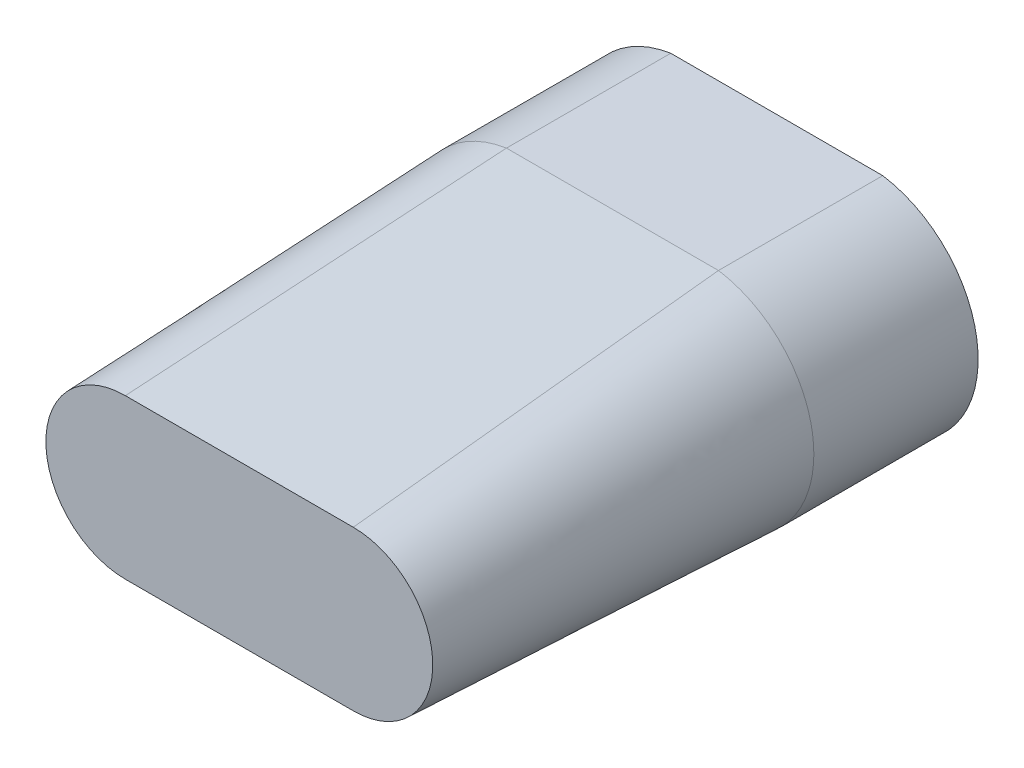
ISO-10303-21;
HEADER;
FILE_DESCRIPTION(('STEP AP214'),'2;1');
FILE_NAME('part.step','',(''),(''),'','','');
FILE_SCHEMA(('AUTOMOTIVE_DESIGN { 1 0 10303 214 1 1 1 1 }'));
ENDSEC;
DATA;
#1=APPLICATION_CONTEXT('core data for automotive mechanical design processes');
#2=APPLICATION_PROTOCOL_DEFINITION('international standard','automotive_design',2000,#1);
#3=PRODUCT_CONTEXT('',#1,'mechanical');
#4=PRODUCT('Part','Part','',(#3));
#5=PRODUCT_RELATED_PRODUCT_CATEGORY('part','',(#4));
#6=PRODUCT_DEFINITION_FORMATION('','',#4);
#7=PRODUCT_DEFINITION_CONTEXT('part definition',#1,'design');
#8=PRODUCT_DEFINITION('design','',#6,#7);
#9=PRODUCT_DEFINITION_SHAPE('','',#8);
#10=(LENGTH_UNIT() NAMED_UNIT(*) SI_UNIT(.MILLI.,.METRE.));
#11=(NAMED_UNIT(*) PLANE_ANGLE_UNIT() SI_UNIT($,.RADIAN.));
#12=(NAMED_UNIT(*) SI_UNIT($,.STERADIAN.) SOLID_ANGLE_UNIT());
#13=UNCERTAINTY_MEASURE_WITH_UNIT(LENGTH_MEASURE(1.E-05),#10,'distance_accuracy_value','');
#14=(GEOMETRIC_REPRESENTATION_CONTEXT(3) GLOBAL_UNCERTAINTY_ASSIGNED_CONTEXT((#13)) GLOBAL_UNIT_ASSIGNED_CONTEXT((#10,
#11,#12)) REPRESENTATION_CONTEXT('',''));
#15=CARTESIAN_POINT('',(0.,0.,0.));
#16=DIRECTION('',(0.,0.,1.));
#17=DIRECTION('',(1.,0.,0.));
#18=AXIS2_PLACEMENT_3D('',#15,#16,#17);
#19=CARTESIAN_POINT('',(-8.32747037974282,0.0666327547418138,15.5));
#20=DIRECTION('',(0.,0.,-1.));
#21=DIRECTION('',(-1.,0.,0.));
#22=AXIS2_PLACEMENT_3D('',#19,#20,#21);
#23=CYLINDRICAL_SURFACE('',#22,10.625);
#24=CARTESIAN_POINT('',(-8.32747037974282,0.0666327547418138,0.));
#25=DIRECTION('',(0.,0.,1.));
#26=DIRECTION('',(1.,0.,0.));
#27=AXIS2_PLACEMENT_3D('',#24,#25,#26);
#28=CIRCLE('',#27,10.625);
#29=CARTESIAN_POINT('',(-9.95247037974286,10.5666327547418,0.));
#30=VERTEX_POINT('',#29);
#31=CARTESIAN_POINT('',(-9.95247037974324,-10.4333672452582,0.));
#32=VERTEX_POINT('',#31);
#33=EDGE_CURVE('E272',#30,#32,#28,.T.);
#34=ORIENTED_EDGE('',*,*,#33,.T.);
#35=DIRECTION('',(0.,0.,-1.));
#36=VECTOR('',#35,1.);
#37=CARTESIAN_POINT('',(-9.95247037974324,-10.4333672452582,15.5));
#38=LINE('',#37,#36);
#39=CARTESIAN_POINT('',(-9.95247037974324,-10.4333672452582,15.5));
#40=VERTEX_POINT('',#39);
#41=EDGE_CURVE('E137',#40,#32,#38,.T.);
#42=ORIENTED_EDGE('',*,*,#41,.F.);
#43=CARTESIAN_POINT('',(-9.95247037974286,10.5666327547418,15.5));
#44=CARTESIAN_POINT('',(-10.8171762620958,10.4328092253301,15.5));
#45=CARTESIAN_POINT('',(-11.7614963021451,10.1785852107884,15.5));
#46=CARTESIAN_POINT('',(-13.2271090430905,9.50975399964273,15.5));
#47=CARTESIAN_POINT('',(-13.7229441927302,9.23872220538477,15.5));
#48=CARTESIAN_POINT('',(-14.704791413138,8.58532625751815,15.5));
#49=CARTESIAN_POINT('',(-15.1907655640472,8.20278019826147,15.5));
#50=CARTESIAN_POINT('',(-16.1193476092315,7.318416345705,15.5));
#51=CARTESIAN_POINT('',(-16.5617974538181,6.81642058594238,15.5));
#52=CARTESIAN_POINT('',(-17.3633745195403,5.6983478137148,15.5));
#53=CARTESIAN_POINT('',(-17.7222205284638,5.08218897127968,15.5));
#54=CARTESIAN_POINT('',(-18.3168665724852,3.75839361137489,15.5));
#55=CARTESIAN_POINT('',(-18.5523405393519,3.05086267321204,15.5));
#56=CARTESIAN_POINT('',(-18.8702546968046,1.58429438734377,15.5));
#57=CARTESIAN_POINT('',(-18.9524703797428,0.825561326170567,15.5));
#58=CARTESIAN_POINT('',(-18.9524703797429,-0.692295816686548,15.5));
#59=CARTESIAN_POINT('',(-18.8702546968047,-1.45102887785975,15.5));
#60=CARTESIAN_POINT('',(-18.552340539352,-2.91759716372804,15.5));
#61=CARTESIAN_POINT('',(-18.3168665724854,-3.62512810189089,15.5));
#62=CARTESIAN_POINT('',(-17.722220528464,-4.94892346179571,15.5));
#63=CARTESIAN_POINT('',(-17.3633745195405,-5.56508230423084,15.5));
#64=CARTESIAN_POINT('',(-16.5617974538184,-6.68315507645845,15.5));
#65=CARTESIAN_POINT('',(-16.1193476092318,-7.18515083622109,15.5));
#66=CARTESIAN_POINT('',(-15.1907655640475,-8.06951468877759,15.5));
#67=CARTESIAN_POINT('',(-14.7047914131383,-8.45206074803429,15.5));
#68=CARTESIAN_POINT('',(-13.7229441927306,-9.10545669590094,15.5));
#69=CARTESIAN_POINT('',(-13.2271090430908,-9.37648849015892,15.5));
#70=CARTESIAN_POINT('',(-11.7614963021455,-10.0453197013047,15.5));
#71=CARTESIAN_POINT('',(-10.8171762620962,-10.2995437158464,15.5));
#72=CARTESIAN_POINT('',(-9.95247037974324,-10.4333672452582,15.5));
#73=B_SPLINE_CURVE_WITH_KNOTS('',3,(#43,#44,#45,#46,#47,#48,#49,#50,#51,#52,#53,#54,#55,#56,#57,
#58,#59,#60,#61,#62,#63,#64,#65,#66,#67,#68,#69,#70,#71,#72),.UNSPECIFIED.,.F.,.F.,(4,2,2,2,2,2,
2,2,2,2,2,2,2,2,4),(0.,0.125,0.1875,0.25,0.3125,0.375,0.4375,0.5,0.5625,0.625,0.6875,0.75,
0.8125,0.875,1.),.UNSPECIFIED.);
#74=CARTESIAN_POINT('',(-9.95247037974286,10.5666327547418,15.5));
#75=VERTEX_POINT('',#74);
#76=EDGE_CURVE('E205',#75,#40,#73,.T.);
#77=ORIENTED_EDGE('',*,*,#76,.F.);
#78=DIRECTION('',(0.,0.,-1.));
#79=VECTOR('',#78,1.);
#80=CARTESIAN_POINT('',(-9.95247037974286,10.5666327547418,15.5));
#81=LINE('',#80,#79);
#82=EDGE_CURVE('E298',#75,#30,#81,.T.);
#83=ORIENTED_EDGE('',*,*,#82,.T.);
#84=EDGE_LOOP('',(#34,#42,#77,#83));
#85=FACE_BOUND('',#84,.T.);
#86=ADVANCED_FACE('F65',(#85),#23,.T.);
#87=CARTESIAN_POINT('',(-9.95247037974324,-10.4333672452582,15.5));
#88=DIRECTION('',(0.,1.,0.));
#89=DIRECTION('',(-1.,0.,0.));
#90=AXIS2_PLACEMENT_3D('',#87,#88,#89);
#91=PLANE('',#90);
#92=DIRECTION('',(1.,0.,0.));
#93=VECTOR('',#92,1.);
#94=CARTESIAN_POINT('',(-9.95247037974324,-10.4333672452582,0.));
#95=LINE('',#94,#93);
#96=CARTESIAN_POINT('',(10.0475296202575,-10.4333672452582,0.));
#97=VERTEX_POINT('',#96);
#98=EDGE_CURVE('E275',#32,#97,#95,.T.);
#99=ORIENTED_EDGE('',*,*,#98,.T.);
#100=DIRECTION('',(0.,0.,-1.));
#101=VECTOR('',#100,1.);
#102=CARTESIAN_POINT('',(10.0475296202575,-10.4333672452582,15.5));
#103=LINE('',#102,#101);
#104=CARTESIAN_POINT('',(10.0475296202575,-10.4333672452582,15.5));
#105=VERTEX_POINT('',#104);
#106=EDGE_CURVE('E311',#105,#97,#103,.T.);
#107=ORIENTED_EDGE('',*,*,#106,.F.);
#108=DIRECTION('',(1.,0.,0.));
#109=VECTOR('',#108,1.);
#110=CARTESIAN_POINT('',(0.,-10.4333672452582,15.5));
#111=LINE('',#110,#109);
#112=EDGE_CURVE('E271',#40,#105,#111,.T.);
#113=ORIENTED_EDGE('',*,*,#112,.F.);
#114=ORIENTED_EDGE('',*,*,#41,.T.);
#115=EDGE_LOOP('',(#99,#107,#113,#114));
#116=FACE_BOUND('',#115,.T.);
#117=ADVANCED_FACE('F333',(#116),#91,.F.);
#118=CARTESIAN_POINT('',(8.42252962025711,0.0666327547418159,15.5));
#119=DIRECTION('',(0.,0.,-1.));
#120=DIRECTION('',(-1.,0.,0.));
#121=AXIS2_PLACEMENT_3D('',#118,#119,#120);
#122=CYLINDRICAL_SURFACE('',#121,10.625);
#123=CARTESIAN_POINT('',(8.42252962025711,0.0666327547418159,0.));
#124=DIRECTION('',(0.,0.,1.));
#125=DIRECTION('',(1.,0.,0.));
#126=AXIS2_PLACEMENT_3D('',#123,#124,#125);
#127=CIRCLE('',#126,10.625);
#128=CARTESIAN_POINT('',(10.0475296202571,10.5666327547418,0.));
#129=VERTEX_POINT('',#128);
#130=EDGE_CURVE('E283',#97,#129,#127,.T.);
#131=ORIENTED_EDGE('',*,*,#130,.T.);
#132=DIRECTION('',(0.,0.,-1.));
#133=VECTOR('',#132,1.);
#134=CARTESIAN_POINT('',(10.0475296202571,10.5666327547418,15.5));
#135=LINE('',#134,#133);
#136=CARTESIAN_POINT('',(10.0475296202571,10.5666327547418,15.5));
#137=VERTEX_POINT('',#136);
#138=EDGE_CURVE('E305',#137,#129,#135,.T.);
#139=ORIENTED_EDGE('',*,*,#138,.F.);
#140=CARTESIAN_POINT('',(10.0475296202575,-10.4333672452582,15.5));
#141=CARTESIAN_POINT('',(10.9122355026105,-10.2995437158464,15.5));
#142=CARTESIAN_POINT('',(11.8565555426597,-10.0453197013047,15.5));
#143=CARTESIAN_POINT('',(13.3221682836051,-9.37648849015892,15.5));
#144=CARTESIAN_POINT('',(13.8180034332448,-9.10545669590095,15.5));
#145=CARTESIAN_POINT('',(14.7998506536526,-8.45206074803429,15.5));
#146=CARTESIAN_POINT('',(15.2858248045618,-8.06951468877759,15.5));
#147=CARTESIAN_POINT('',(16.2144068497461,-7.18515083622109,15.5));
#148=CARTESIAN_POINT('',(16.6568566943327,-6.68315507645845,15.5));
#149=CARTESIAN_POINT('',(17.4584337600548,-5.56508230423084,15.5));
#150=CARTESIAN_POINT('',(17.8172797689783,-4.94892346179571,15.5));
#151=CARTESIAN_POINT('',(18.4119258129996,-3.6251281018909,15.5));
#152=CARTESIAN_POINT('',(18.6473997798663,-2.91759716372804,15.5));
#153=CARTESIAN_POINT('',(18.965313937319,-1.45102887785975,15.5));
#154=CARTESIAN_POINT('',(19.0475296202572,-0.692295816686549,15.5));
#155=CARTESIAN_POINT('',(19.0475296202571,0.825561326170567,15.5));
#156=CARTESIAN_POINT('',(18.9653139373189,1.58429438734377,15.5));
#157=CARTESIAN_POINT('',(18.6473997798662,3.05086267321204,15.5));
#158=CARTESIAN_POINT('',(18.4119258129995,3.75839361137489,15.5));
#159=CARTESIAN_POINT('',(17.8172797689781,5.08218897127968,15.5));
#160=CARTESIAN_POINT('',(17.4584337600546,5.6983478137148,15.5));
#161=CARTESIAN_POINT('',(16.6568566943324,6.81642058594239,15.5));
#162=CARTESIAN_POINT('',(16.2144068497458,7.31841634570501,15.5));
#163=CARTESIAN_POINT('',(15.2858248045615,8.20278019826148,15.5));
#164=CARTESIAN_POINT('',(14.7998506536523,8.58532625751815,15.5));
#165=CARTESIAN_POINT('',(13.8180034332445,9.23872220538477,15.5));
#166=CARTESIAN_POINT('',(13.3221682836048,9.50975399964273,15.5));
#167=CARTESIAN_POINT('',(11.8565555426594,10.1785852107885,15.5));
#168=CARTESIAN_POINT('',(10.9122355026101,10.4328092253301,15.5));
#169=CARTESIAN_POINT('',(10.0475296202571,10.5666327547418,15.5));
#170=B_SPLINE_CURVE_WITH_KNOTS('',3,(#140,#141,#142,#143,#144,#145,#146,#147,#148,#149,#150,
#151,#152,#153,#154,#155,#156,#157,#158,#159,#160,#161,#162,#163,#164,#165,#166,#167,#168,#169),
.UNSPECIFIED.,.F.,.F.,(4,2,2,2,2,2,2,2,2,2,2,2,2,2,4),(0.,0.125,0.1875,0.25,0.3125,0.375,0.4375,
0.5,0.5625,0.625,0.6875,0.75,0.8125,0.875,1.),.UNSPECIFIED.);
#171=EDGE_CURVE('E318',#105,#137,#170,.T.);
#172=ORIENTED_EDGE('',*,*,#171,.F.);
#173=ORIENTED_EDGE('',*,*,#106,.T.);
#174=EDGE_LOOP('',(#131,#139,#172,#173));
#175=FACE_BOUND('',#174,.T.);
#176=ADVANCED_FACE('F324',(#175),#122,.T.);
#177=CARTESIAN_POINT('',(-9.95247037974286,10.5666327547418,15.5));
#178=DIRECTION('',(0.,-1.,0.));
#179=DIRECTION('',(1.,0.,0.));
#180=AXIS2_PLACEMENT_3D('',#177,#178,#179);
#181=PLANE('',#180);
#182=DIRECTION('',(-1.,0.,0.));
#183=VECTOR('',#182,1.);
#184=CARTESIAN_POINT('',(-9.95247037974286,10.5666327547418,0.));
#185=LINE('',#184,#183);
#186=EDGE_CURVE('E291',#129,#30,#185,.T.);
#187=ORIENTED_EDGE('',*,*,#186,.T.);
#188=ORIENTED_EDGE('',*,*,#82,.F.);
#189=DIRECTION('',(1.,0.,0.));
#190=VECTOR('',#189,1.);
#191=CARTESIAN_POINT('',(0.,10.5666327547418,15.5));
#192=LINE('',#191,#190);
#193=EDGE_CURVE('E306',#137,#75,#192,.F.);
#194=ORIENTED_EDGE('',*,*,#193,.F.);
#195=ORIENTED_EDGE('',*,*,#138,.T.);
#196=EDGE_LOOP('',(#187,#188,#194,#195));
#197=FACE_BOUND('',#196,.T.);
#198=ADVANCED_FACE('F332',(#197),#181,.F.);
#199=CARTESIAN_POINT('',(-8.32747037974282,0.0666327547418138,0.));
#200=DIRECTION('',(0.,0.,1.));
#201=DIRECTION('',(1.,0.,0.));
#202=AXIS2_PLACEMENT_3D('',#199,#200,#201);
#203=PLANE('',#202);
#204=ORIENTED_EDGE('',*,*,#33,.F.);
#205=ORIENTED_EDGE('',*,*,#186,.F.);
#206=ORIENTED_EDGE('',*,*,#130,.F.);
#207=ORIENTED_EDGE('',*,*,#98,.F.);
#208=EDGE_LOOP('',(#204,#205,#206,#207));
#209=FACE_BOUND('',#208,.T.);
#210=ADVANCED_FACE('F178',(#209),#203,.F.);
#211=CARTESIAN_POINT('',(-10.7024703797429,0.0666327547418429,50.7));
#212=DIRECTION('',(0.,0.,-1.));
#213=DIRECTION('',(-1.,0.,0.));
#214=AXIS2_PLACEMENT_3D('',#211,#212,#213);
#215=PLANE('',#214);
#216=CARTESIAN_POINT('',(-10.7024703797429,0.0666327547418429,50.7));
#217=DIRECTION('',(0.,0.,1.));
#218=DIRECTION('',(-1.,0.,0.));
#219=AXIS2_PLACEMENT_3D('',#216,#217,#218);
#220=CIRCLE('',#219,7.5);
#221=CARTESIAN_POINT('',(-10.7024703797429,7.56663275474185,50.7));
#222=VERTEX_POINT('',#221);
#223=CARTESIAN_POINT('',(-10.7024703797429,-7.43336724525816,50.7));
#224=VERTEX_POINT('',#223);
#225=EDGE_CURVE('E140',#222,#224,#220,.T.);
#226=ORIENTED_EDGE('',*,*,#225,.T.);
#227=DIRECTION('',(1.,0.,0.));
#228=VECTOR('',#227,1.);
#229=CARTESIAN_POINT('',(10.7975296202571,-7.43336724525816,50.7));
#230=LINE('',#229,#228);
#231=CARTESIAN_POINT('',(10.7975296202571,-7.43336724525816,50.7));
#232=VERTEX_POINT('',#231);
#233=EDGE_CURVE('E151',#224,#232,#230,.T.);
#234=ORIENTED_EDGE('',*,*,#233,.T.);
#235=CARTESIAN_POINT('',(10.7975296202571,0.0666327547418429,50.7));
#236=DIRECTION('',(0.,0.,1.));
#237=DIRECTION('',(-1.,0.,0.));
#238=AXIS2_PLACEMENT_3D('',#235,#236,#237);
#239=CIRCLE('',#238,7.5);
#240=CARTESIAN_POINT('',(10.7975296202571,7.56663275474185,50.7));
#241=VERTEX_POINT('',#240);
#242=EDGE_CURVE('E266',#232,#241,#239,.T.);
#243=ORIENTED_EDGE('',*,*,#242,.T.);
#244=DIRECTION('',(-1.,0.,0.));
#245=VECTOR('',#244,1.);
#246=CARTESIAN_POINT('',(-10.7024703797429,7.56663275474185,50.7));
#247=LINE('',#246,#245);
#248=EDGE_CURVE('E143',#241,#222,#247,.T.);
#249=ORIENTED_EDGE('',*,*,#248,.T.);
#250=EDGE_LOOP('',(#226,#234,#243,#249));
#251=FACE_BOUND('',#250,.T.);
#252=ADVANCED_FACE('F221',(#251),#215,.F.);
#253=CARTESIAN_POINT('',(-10.7024703797429,-7.43336724525816,50.7));
#254=CARTESIAN_POINT('',(-9.95247037974324,-10.4333672452582,15.5));
#255=CARTESIAN_POINT('',(-11.3274703797429,-7.43336724525816,50.7));
#256=CARTESIAN_POINT('',(-10.8171762620962,-10.2995437158464,15.5));
#257=CARTESIAN_POINT('',(-12.0344703797428,-7.35736724525816,50.7));
#258=CARTESIAN_POINT('',(-11.7614963021455,-10.0453197013047,15.5));
#259=CARTESIAN_POINT('',(-13.1864703797429,-7.02136724525816,50.7));
#260=CARTESIAN_POINT('',(-13.2271090430908,-9.37648849015892,15.5));
#261=CARTESIAN_POINT('',(-13.5849978383971,-6.87188510916423,50.7));
#262=CARTESIAN_POINT('',(-13.7229441927306,-9.10545669590094,15.5));
#263=CARTESIAN_POINT('',(-14.3929766289538,-6.47799544876782,50.7));
#264=CARTESIAN_POINT('',(-14.7047914131383,-8.45206074803429,15.5));
#265=CARTESIAN_POINT('',(-14.8024703797429,-6.23336724525816,50.7));
#266=CARTESIAN_POINT('',(-15.1907655640475,-8.06951468877759,15.5));
#267=CARTESIAN_POINT('',(-15.6024703797429,-5.63336724525816,50.7));
#268=CARTESIAN_POINT('',(-16.1193476092318,-7.18515083622109,15.5));
#269=CARTESIAN_POINT('',(-15.9928625734002,-5.27770952335912,50.7));
#270=CARTESIAN_POINT('',(-16.5617974538184,-6.68315507645845,15.5));
#271=CARTESIAN_POINT('',(-16.7134480490992,-4.45203866578734,50.7));
#272=CARTESIAN_POINT('',(-17.3633745195405,-5.56508230423084,15.5));
#273=CARTESIAN_POINT('',(-17.0433008295698,-3.98181015183255,50.7));
#274=CARTESIAN_POINT('',(-17.722220528464,-4.94892346179571,15.5));
#275=CARTESIAN_POINT('',(-17.5969340475629,-2.94374786809553,50.7));
#276=CARTESIAN_POINT('',(-18.3168665724854,-3.62512810189089,15.5));
#277=CARTESIAN_POINT('',(-17.8202218590328,-2.37597079555402,50.7));
#278=CARTESIAN_POINT('',(-18.552340539352,-2.91759716372804,15.5));
#279=CARTESIAN_POINT('',(-18.1231804389145,-1.18307138726999,50.7));
#280=CARTESIAN_POINT('',(-18.8702546968047,-1.45102887785975,15.5));
#281=CARTESIAN_POINT('',(-18.2024703797429,-0.558367245258158,50.7));
#282=CARTESIAN_POINT('',(-18.9524703797429,-0.692295816686548,15.5));
#283=CARTESIAN_POINT('',(-18.2024703797429,0.691632754741843,50.7));
#284=CARTESIAN_POINT('',(-18.9524703797428,0.825561326170567,15.5));
#285=CARTESIAN_POINT('',(-18.1231804389145,1.31633689675368,50.7));
#286=CARTESIAN_POINT('',(-18.8702546968046,1.58429438734377,15.5));
#287=CARTESIAN_POINT('',(-17.8202218590328,2.5092363050377,50.7));
#288=CARTESIAN_POINT('',(-18.5523405393519,3.05086267321204,15.5));
#289=CARTESIAN_POINT('',(-17.5969340475629,3.07701337757922,50.7));
#290=CARTESIAN_POINT('',(-18.3168665724852,3.75839361137489,15.5));
#291=CARTESIAN_POINT('',(-17.0433008295698,4.11507566131624,50.7));
#292=CARTESIAN_POINT('',(-17.7222205284638,5.08218897127968,15.5));
#293=CARTESIAN_POINT('',(-16.7134480490992,4.58530417527103,50.7));
#294=CARTESIAN_POINT('',(-17.3633745195403,5.6983478137148,15.5));
#295=CARTESIAN_POINT('',(-15.9928625734002,5.4109750328428,50.7));
#296=CARTESIAN_POINT('',(-16.5617974538181,6.81642058594238,15.5));
#297=CARTESIAN_POINT('',(-15.6024703797429,5.76663275474185,50.7));
#298=CARTESIAN_POINT('',(-16.1193476092315,7.318416345705,15.5));
#299=CARTESIAN_POINT('',(-14.8024703797429,6.36663275474185,50.7));
#300=CARTESIAN_POINT('',(-15.1907655640472,8.20278019826147,15.5));
#301=CARTESIAN_POINT('',(-14.3929766289538,6.6112609582515,50.7));
#302=CARTESIAN_POINT('',(-14.704791413138,8.58532625751815,15.5));
#303=CARTESIAN_POINT('',(-13.5849978383971,7.00515061864792,50.7));
#304=CARTESIAN_POINT('',(-13.7229441927302,9.23872220538477,15.5));
#305=CARTESIAN_POINT('',(-13.1864703797429,7.15463275474185,50.7));
#306=CARTESIAN_POINT('',(-13.2271090430905,9.50975399964273,15.5));
#307=CARTESIAN_POINT('',(-12.0344703797429,7.49063275474185,50.7));
#308=CARTESIAN_POINT('',(-11.7614963021451,10.1785852107884,15.5));
#309=CARTESIAN_POINT('',(-11.3274703797428,7.56663275474184,50.7));
#310=CARTESIAN_POINT('',(-10.8171762620958,10.4328092253301,15.5));
#311=CARTESIAN_POINT('',(-10.7024703797429,7.56663275474185,50.7));
#312=CARTESIAN_POINT('',(-9.95247037974286,10.5666327547418,15.5));
#313=B_SPLINE_SURFACE_WITH_KNOTS('',3,1,((#253,#254),(#255,#256),(#257,#258),(#259,#260),(#261,
#262),(#263,#264),(#265,#266),(#267,#268),(#269,#270),(#271,#272),(#273,#274),(#275,#276),(#277,
#278),(#279,#280),(#281,#282),(#283,#284),(#285,#286),(#287,#288),(#289,#290),(#291,#292),(#293,
#294),(#295,#296),(#297,#298),(#299,#300),(#301,#302),(#303,#304),(#305,#306),(#307,#308),(#309,
#310),(#311,#312)),.UNSPECIFIED.,.F.,.F.,.F.,(4,2,2,2,2,2,2,2,2,2,2,2,2,2,4),(2,2),(0.,0.125,
0.1875,0.25,0.3125,0.375,0.4375,0.5,0.5625,0.625,0.6875,0.75,0.8125,0.875,1.),(0.,1.),.UNSPECIFIED.);
#314=DIRECTION('',(0.0212250715686738,0.0849002862746967,-0.996163358956441));
#315=VECTOR('',#314,1.);
#316=CARTESIAN_POINT('',(-10.3274703797429,9.06663275474184,33.1));
#317=LINE('',#316,#315);
#318=EDGE_CURVE('E237',#222,#75,#317,.T.);
#319=DIRECTION('',(-0.0212250715686632,0.0849002862746966,0.996163358956441));
#320=VECTOR('',#319,1.);
#321=CARTESIAN_POINT('',(-10.327470379743,-8.93336724525816,33.1));
#322=LINE('',#321,#320);
#323=EDGE_CURVE('E156',#40,#224,#322,.T.);
#324=ORIENTED_EDGE('',*,*,#225,.F.);
#325=ORIENTED_EDGE('',*,*,#318,.T.);
#326=ORIENTED_EDGE('',*,*,#76,.T.);
#327=ORIENTED_EDGE('',*,*,#323,.T.);
#328=EDGE_LOOP('',(#324,#325,#326,#327));
#329=FACE_BOUND('',#328,.T.);
#330=ADVANCED_FACE('F210',(#329),#313,.T.);
#331=CARTESIAN_POINT('',(0.,11.8019299449019,1.00584630212232));
#332=DIRECTION('',(0.,0.996387822421624,0.0849194166836612));
#333=DIRECTION('',(0.,-0.0849194166836612,0.996387822421624));
#334=AXIS2_PLACEMENT_3D('',#331,#332,#333);
#335=PLANE('',#334);
#336=DIRECTION('',(-0.0212250715686742,0.0849002862746967,-0.996163358956441));
#337=VECTOR('',#336,1.);
#338=CARTESIAN_POINT('',(10.7975296202571,7.56663275474185,50.7));
#339=LINE('',#338,#337);
#340=EDGE_CURVE('E244',#241,#137,#339,.T.);
#341=ORIENTED_EDGE('',*,*,#340,.T.);
#342=ORIENTED_EDGE('',*,*,#193,.T.);
#343=ORIENTED_EDGE('',*,*,#318,.F.);
#344=ORIENTED_EDGE('',*,*,#248,.F.);
#345=EDGE_LOOP('',(#341,#342,#343,#344));
#346=FACE_BOUND('',#345,.T.);
#347=ADVANCED_FACE('F168',(#346),#335,.T.);
#348=CARTESIAN_POINT('',(0.,-11.6696254539635,0.994570351190074));
#349=DIRECTION('',(0.,-0.996387822421624,0.0849194166836611));
#350=DIRECTION('',(0.,-0.0849194166836611,-0.996387822421624));
#351=AXIS2_PLACEMENT_3D('',#348,#349,#350);
#352=PLANE('',#351);
#353=DIRECTION('',(1.,0.,0.));
#354=VECTOR('',#353,1.);
#355=CARTESIAN_POINT('',(5.72928121587779,-8.9324076317056,33.1112594656833));
#356=LINE('',#355,#354);
#357=CARTESIAN_POINT('',(-2.75,-8.9324076317056,33.1112594656833));
#358=VERTEX_POINT('',#357);
#359=CARTESIAN_POINT('',(2.75,-8.9324076317056,33.1112594656833));
#360=VERTEX_POINT('',#359);
#361=EDGE_CURVE('E12',#358,#360,#356,.T.);
#362=ORIENTED_EDGE('',*,*,#361,.F.);
#363=DIRECTION('',(0.,-0.0849194166836611,-0.996387822421624));
#364=VECTOR('',#363,1.);
#365=CARTESIAN_POINT('',(-2.75,-11.6696254539635,0.994570351190074));
#366=LINE('',#365,#364);
#367=CARTESIAN_POINT('',(-2.75,-8.07031560082647,43.2264726279984));
#368=VERTEX_POINT('',#367);
#369=EDGE_CURVE('E122',#368,#358,#366,.T.);
#370=ORIENTED_EDGE('',*,*,#369,.F.);
#371=DIRECTION('',(1.,0.,0.));
#372=VECTOR('',#371,1.);
#373=CARTESIAN_POINT('',(5.72928121587779,-8.07031560082648,43.2264726279984));
#374=LINE('',#373,#372);
#375=CARTESIAN_POINT('',(2.75,-8.07031560082648,43.2264726279984));
#376=VERTEX_POINT('',#375);
#377=EDGE_CURVE('E126',#376,#368,#374,.F.);
#378=ORIENTED_EDGE('',*,*,#377,.F.);
#379=DIRECTION('',(0.,0.0849194166836611,0.996387822421624));
#380=VECTOR('',#379,1.);
#381=CARTESIAN_POINT('',(2.75,-11.6696254539635,0.994570351190074));
#382=LINE('',#381,#380);
#383=EDGE_CURVE('E73',#360,#376,#382,.T.);
#384=ORIENTED_EDGE('',*,*,#383,.F.);
#385=EDGE_LOOP('',(#362,#370,#378,#384));
#386=FACE_BOUND('',#385,.T.);
#387=ORIENTED_EDGE('',*,*,#323,.F.);
#388=ORIENTED_EDGE('',*,*,#112,.T.);
#389=DIRECTION('',(-0.0212250715686634,-0.0849002862746966,-0.996163358956441));
#390=VECTOR('',#389,1.);
#391=CARTESIAN_POINT('',(10.4225296202573,-8.93336724525816,33.1));
#392=LINE('',#391,#390);
#393=EDGE_CURVE('E262',#232,#105,#392,.T.);
#394=ORIENTED_EDGE('',*,*,#393,.F.);
#395=ORIENTED_EDGE('',*,*,#233,.F.);
#396=EDGE_LOOP('',(#387,#388,#394,#395));
#397=FACE_BOUND('',#396,.T.);
#398=ADVANCED_FACE('F124',(#386,#397),#352,.T.);
#399=CARTESIAN_POINT('',(10.7975296202571,7.56663275474185,50.7));
#400=CARTESIAN_POINT('',(10.0475296202571,10.5666327547418,15.5));
#401=CARTESIAN_POINT('',(11.4225296202571,7.56663275474184,50.7));
#402=CARTESIAN_POINT('',(10.9122355026101,10.4328092253301,15.5));
#403=CARTESIAN_POINT('',(12.1295296202572,7.49063275474185,50.7));
#404=CARTESIAN_POINT('',(11.8565555426594,10.1785852107885,15.5));
#405=CARTESIAN_POINT('',(13.2815296202571,7.15463275474185,50.7));
#406=CARTESIAN_POINT('',(13.3221682836048,9.50975399964273,15.5));
#407=CARTESIAN_POINT('',(13.6800570789114,7.00515061864791,50.7));
#408=CARTESIAN_POINT('',(13.8180034332445,9.23872220538477,15.5));
#409=CARTESIAN_POINT('',(14.4880358694681,6.6112609582515,50.7));
#410=CARTESIAN_POINT('',(14.7998506536523,8.58532625751815,15.5));
#411=CARTESIAN_POINT('',(14.8975296202571,6.36663275474185,50.7));
#412=CARTESIAN_POINT('',(15.2858248045615,8.20278019826148,15.5));
#413=CARTESIAN_POINT('',(15.6975296202572,5.76663275474184,50.7));
#414=CARTESIAN_POINT('',(16.2144068497458,7.31841634570501,15.5));
#415=CARTESIAN_POINT('',(16.0879218139145,5.4109750328428,50.7));
#416=CARTESIAN_POINT('',(16.6568566943324,6.81642058594239,15.5));
#417=CARTESIAN_POINT('',(16.8085072896135,4.58530417527102,50.7));
#418=CARTESIAN_POINT('',(17.4584337600546,5.6983478137148,15.5));
#419=CARTESIAN_POINT('',(17.1383600700841,4.11507566131624,50.7));
#420=CARTESIAN_POINT('',(17.8172797689781,5.08218897127968,15.5));
#421=CARTESIAN_POINT('',(17.6919932880772,3.07701337757921,50.7));
#422=CARTESIAN_POINT('',(18.4119258129995,3.75839361137489,15.5));
#423=CARTESIAN_POINT('',(17.9152810995471,2.5092363050377,50.7));
#424=CARTESIAN_POINT('',(18.6473997798662,3.05086267321204,15.5));
#425=CARTESIAN_POINT('',(18.2182396794287,1.31633689675368,50.7));
#426=CARTESIAN_POINT('',(18.9653139373189,1.58429438734377,15.5));
#427=CARTESIAN_POINT('',(18.2975296202572,0.691632754741842,50.7));
#428=CARTESIAN_POINT('',(19.0475296202571,0.825561326170567,15.5));
#429=CARTESIAN_POINT('',(18.2975296202572,-0.558367245258159,50.7));
#430=CARTESIAN_POINT('',(19.0475296202572,-0.692295816686549,15.5));
#431=CARTESIAN_POINT('',(18.2182396794287,-1.18307138726999,50.7));
#432=CARTESIAN_POINT('',(18.965313937319,-1.45102887785975,15.5));
#433=CARTESIAN_POINT('',(17.9152810995471,-2.37597079555402,50.7));
#434=CARTESIAN_POINT('',(18.6473997798663,-2.91759716372804,15.5));
#435=CARTESIAN_POINT('',(17.6919932880772,-2.94374786809553,50.7));
#436=CARTESIAN_POINT('',(18.4119258129996,-3.6251281018909,15.5));
#437=CARTESIAN_POINT('',(17.1383600700841,-3.98181015183255,50.7));
#438=CARTESIAN_POINT('',(17.8172797689783,-4.94892346179571,15.5));
#439=CARTESIAN_POINT('',(16.8085072896135,-4.45203866578734,50.7));
#440=CARTESIAN_POINT('',(17.4584337600548,-5.56508230423084,15.5));
#441=CARTESIAN_POINT('',(16.0879218139145,-5.27770952335911,50.7));
#442=CARTESIAN_POINT('',(16.6568566943327,-6.68315507645845,15.5));
#443=CARTESIAN_POINT('',(15.6975296202571,-5.63336724525816,50.7));
#444=CARTESIAN_POINT('',(16.2144068497461,-7.18515083622109,15.5));
#445=CARTESIAN_POINT('',(14.8975296202571,-6.23336724525816,50.7));
#446=CARTESIAN_POINT('',(15.2858248045618,-8.06951468877759,15.5));
#447=CARTESIAN_POINT('',(14.4880358694681,-6.47799544876782,50.7));
#448=CARTESIAN_POINT('',(14.7998506536526,-8.45206074803429,15.5));
#449=CARTESIAN_POINT('',(13.6800570789114,-6.87188510916423,50.7));
#450=CARTESIAN_POINT('',(13.8180034332448,-9.10545669590095,15.5));
#451=CARTESIAN_POINT('',(13.2815296202571,-7.02136724525816,50.7));
#452=CARTESIAN_POINT('',(13.3221682836051,-9.37648849015892,15.5));
#453=CARTESIAN_POINT('',(12.1295296202572,-7.35736724525816,50.7));
#454=CARTESIAN_POINT('',(11.8565555426597,-10.0453197013047,15.5));
#455=CARTESIAN_POINT('',(11.4225296202571,-7.43336724525816,50.7));
#456=CARTESIAN_POINT('',(10.9122355026105,-10.2995437158464,15.5));
#457=CARTESIAN_POINT('',(10.7975296202571,-7.43336724525816,50.7));
#458=CARTESIAN_POINT('',(10.0475296202575,-10.4333672452582,15.5));
#459=B_SPLINE_SURFACE_WITH_KNOTS('',3,1,((#399,#400),(#401,#402),(#403,#404),(#405,#406),(#407,
#408),(#409,#410),(#411,#412),(#413,#414),(#415,#416),(#417,#418),(#419,#420),(#421,#422),(#423,
#424),(#425,#426),(#427,#428),(#429,#430),(#431,#432),(#433,#434),(#435,#436),(#437,#438),(#439,
#440),(#441,#442),(#443,#444),(#445,#446),(#447,#448),(#449,#450),(#451,#452),(#453,#454),(#455,
#456),(#457,#458)),.UNSPECIFIED.,.F.,.F.,.F.,(4,2,2,2,2,2,2,2,2,2,2,2,2,2,4),(2,2),(0.,0.125,
0.1875,0.25,0.3125,0.375,0.4375,0.5,0.5625,0.625,0.6875,0.75,0.8125,0.875,1.),(0.,1.),.UNSPECIFIED.);
#460=ORIENTED_EDGE('',*,*,#242,.F.);
#461=ORIENTED_EDGE('',*,*,#393,.T.);
#462=ORIENTED_EDGE('',*,*,#171,.T.);
#463=ORIENTED_EDGE('',*,*,#340,.F.);
#464=EDGE_LOOP('',(#460,#461,#462,#463));
#465=FACE_BOUND('',#464,.T.);
#466=ADVANCED_FACE('F167',(#465),#459,.T.);
#467=CARTESIAN_POINT('',(2.75,-3.,32.2));
#468=DIRECTION('',(1.,0.,0.));
#469=DIRECTION('',(0.,0.,-1.));
#470=AXIS2_PLACEMENT_3D('',#467,#468,#469);
#471=PLANE('',#470);
#472=CARTESIAN_POINT('',(2.75,-3.,37.7));
#473=DIRECTION('',(1.,0.,0.));
#474=DIRECTION('',(0.,0.,-1.));
#475=AXIS2_PLACEMENT_3D('',#472,#473,#474);
#476=CIRCLE('',#475,7.5);
#477=EDGE_CURVE('E136',#376,#360,#476,.T.);
#478=ORIENTED_EDGE('',*,*,#477,.T.);
#479=ORIENTED_EDGE('',*,*,#383,.T.);
#480=EDGE_LOOP('',(#478,#479));
#481=FACE_BOUND('',#480,.T.);
#482=ADVANCED_FACE('F176',(#481),#471,.T.);
#483=CARTESIAN_POINT('',(-2.75,-3.,32.2));
#484=DIRECTION('',(-1.,0.,0.));
#485=DIRECTION('',(0.,0.,1.));
#486=AXIS2_PLACEMENT_3D('',#483,#484,#485);
#487=PLANE('',#486);
#488=CARTESIAN_POINT('',(-2.75,-3.,37.7));
#489=DIRECTION('',(1.,0.,0.));
#490=DIRECTION('',(0.,0.,-1.));
#491=AXIS2_PLACEMENT_3D('',#488,#489,#490);
#492=CIRCLE('',#491,7.5);
#493=EDGE_CURVE('E134',#368,#358,#492,.T.);
#494=ORIENTED_EDGE('',*,*,#493,.F.);
#495=ORIENTED_EDGE('',*,*,#369,.T.);
#496=EDGE_LOOP('',(#494,#495));
#497=FACE_BOUND('',#496,.T.);
#498=ADVANCED_FACE('F139',(#497),#487,.T.);
#499=CARTESIAN_POINT('',(5.72928121587779,-3.,37.7));
#500=DIRECTION('',(1.,0.,0.));
#501=DIRECTION('',(0.,0.,-1.));
#502=AXIS2_PLACEMENT_3D('',#499,#500,#501);
#503=CYLINDRICAL_SURFACE('',#502,7.5);
#504=ORIENTED_EDGE('',*,*,#493,.T.);
#505=ORIENTED_EDGE('',*,*,#361,.T.);
#506=ORIENTED_EDGE('',*,*,#477,.F.);
#507=ORIENTED_EDGE('',*,*,#377,.T.);
#508=EDGE_LOOP('',(#504,#505,#506,#507));
#509=FACE_BOUND('',#508,.T.);
#510=ADVANCED_FACE('F133',(#509),#503,.T.);
#511=CLOSED_SHELL('',(#86,#117,#176,#198,#210,#252,#330,#347,#398,#466,#482,#498,#510));
#512=MANIFOLD_SOLID_BREP('B2',#511);
#513=ADVANCED_BREP_SHAPE_REPRESENTATION('',(#18,#512),#14);
#514=SHAPE_DEFINITION_REPRESENTATION(#9,#513);
ENDSEC;
END-ISO-10303-21;
